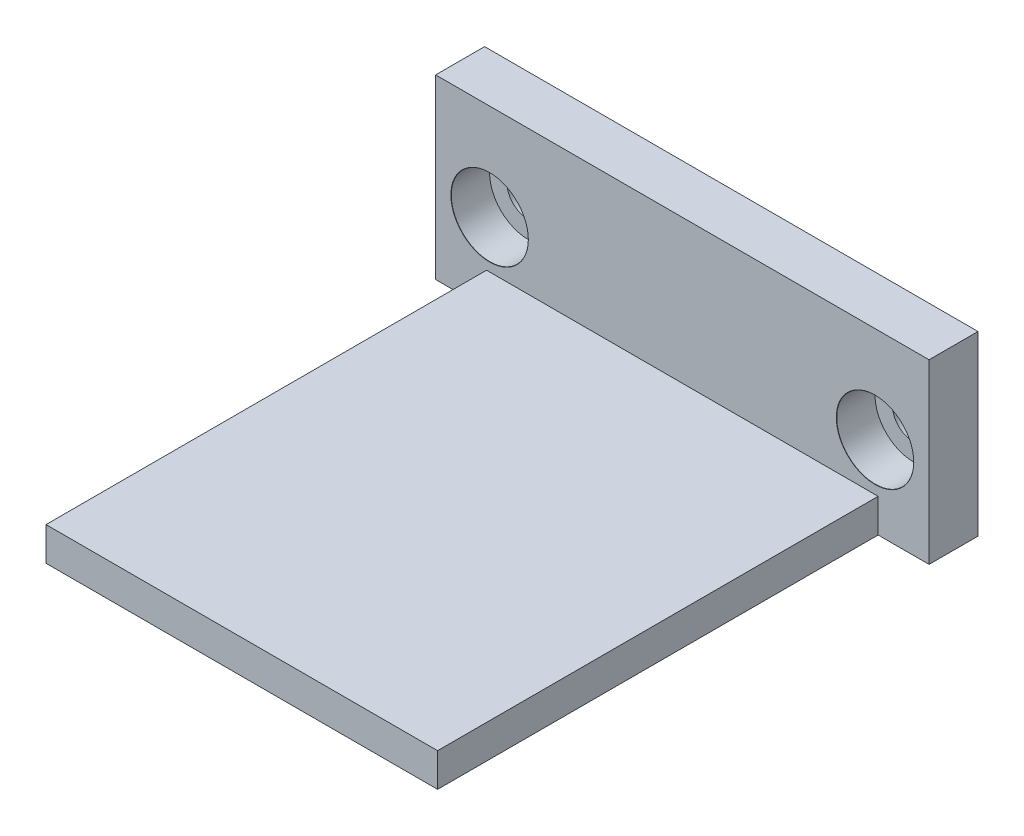
ISO-10303-21;
HEADER;
FILE_DESCRIPTION(('STEP AP214'),'2;1');
FILE_NAME('part.step','',(''),(''),'','','');
FILE_SCHEMA(('AUTOMOTIVE_DESIGN { 1 0 10303 214 1 1 1 1 }'));
ENDSEC;
DATA;
#1=APPLICATION_CONTEXT('core data for automotive mechanical design processes');
#2=APPLICATION_PROTOCOL_DEFINITION('international standard','automotive_design',2000,#1);
#3=PRODUCT_CONTEXT('',#1,'mechanical');
#4=PRODUCT('Part','Part','',(#3));
#5=PRODUCT_RELATED_PRODUCT_CATEGORY('part','',(#4));
#6=PRODUCT_DEFINITION_FORMATION('','',#4);
#7=PRODUCT_DEFINITION_CONTEXT('part definition',#1,'design');
#8=PRODUCT_DEFINITION('design','',#6,#7);
#9=PRODUCT_DEFINITION_SHAPE('','',#8);
#10=(LENGTH_UNIT() NAMED_UNIT(*) SI_UNIT(.MILLI.,.METRE.));
#11=(NAMED_UNIT(*) PLANE_ANGLE_UNIT() SI_UNIT($,.RADIAN.));
#12=(NAMED_UNIT(*) SI_UNIT($,.STERADIAN.) SOLID_ANGLE_UNIT());
#13=UNCERTAINTY_MEASURE_WITH_UNIT(LENGTH_MEASURE(1.E-05),#10,'distance_accuracy_value','');
#14=(GEOMETRIC_REPRESENTATION_CONTEXT(3) GLOBAL_UNCERTAINTY_ASSIGNED_CONTEXT((#13)) GLOBAL_UNIT_ASSIGNED_CONTEXT((#10,
#11,#12)) REPRESENTATION_CONTEXT('',''));
#15=CARTESIAN_POINT('',(0.,0.,0.));
#16=DIRECTION('',(0.,0.,1.));
#17=DIRECTION('',(1.,0.,0.));
#18=AXIS2_PLACEMENT_3D('',#15,#16,#17);
#19=CARTESIAN_POINT('',(0.,0.,6.35));
#20=DIRECTION('',(0.,0.,-1.));
#21=DIRECTION('',(-1.,0.,0.));
#22=AXIS2_PLACEMENT_3D('',#19,#20,#21);
#23=PLANE('',#22);
#24=DIRECTION('',(0.,-1.,0.));
#25=VECTOR('',#24,1.);
#26=CARTESIAN_POINT('',(0.,0.,6.35));
#27=LINE('',#26,#25);
#28=CARTESIAN_POINT('',(0.,24.9936,6.35));
#29=VERTEX_POINT('',#28);
#30=CARTESIAN_POINT('',(0.,2.000000064,6.35));
#31=VERTEX_POINT('',#30);
#32=EDGE_CURVE('E128',#29,#31,#27,.T.);
#33=ORIENTED_EDGE('',*,*,#32,.T.);
#34=DIRECTION('',(1.,0.,0.));
#35=VECTOR('',#34,1.);
#36=CARTESIAN_POINT('',(0.,2.000000064,6.35));
#37=LINE('',#36,#35);
#38=CARTESIAN_POINT('',(6.604,2.000000064,6.35));
#39=VERTEX_POINT('',#38);
#40=EDGE_CURVE('E199',#31,#39,#37,.T.);
#41=ORIENTED_EDGE('',*,*,#40,.T.);
#42=DIRECTION('',(0.,1.,0.));
#43=VECTOR('',#42,1.);
#44=CARTESIAN_POINT('',(6.604,6.35,6.35));
#45=LINE('',#44,#43);
#46=CARTESIAN_POINT('',(6.604,6.35,6.35));
#47=VERTEX_POINT('',#46);
#48=EDGE_CURVE('E193',#39,#47,#45,.T.);
#49=ORIENTED_EDGE('',*,*,#48,.T.);
#50=DIRECTION('',(-1.,0.,0.));
#51=VECTOR('',#50,1.);
#52=CARTESIAN_POINT('',(0.,6.35,6.35));
#53=LINE('',#52,#51);
#54=CARTESIAN_POINT('',(57.404,6.35,6.35));
#55=VERTEX_POINT('',#54);
#56=EDGE_CURVE('E147',#55,#47,#53,.T.);
#57=ORIENTED_EDGE('',*,*,#56,.F.);
#58=DIRECTION('',(0.,-1.,0.));
#59=VECTOR('',#58,1.);
#60=CARTESIAN_POINT('',(57.404,6.35,6.35));
#61=LINE('',#60,#59);
#62=CARTESIAN_POINT('',(57.404,2.000000064,6.35));
#63=VERTEX_POINT('',#62);
#64=EDGE_CURVE('E186',#55,#63,#61,.T.);
#65=ORIENTED_EDGE('',*,*,#64,.T.);
#66=CARTESIAN_POINT('',(64.008,2.000000064,6.35));
#67=VERTEX_POINT('',#66);
#68=EDGE_CURVE('E189',#63,#67,#37,.T.);
#69=ORIENTED_EDGE('',*,*,#68,.T.);
#70=DIRECTION('',(0.,1.,0.));
#71=VECTOR('',#70,1.);
#72=CARTESIAN_POINT('',(64.008,0.,6.35));
#73=LINE('',#72,#71);
#74=CARTESIAN_POINT('',(64.008,24.9936,6.35));
#75=VERTEX_POINT('',#74);
#76=EDGE_CURVE('E120',#67,#75,#73,.T.);
#77=ORIENTED_EDGE('',*,*,#76,.T.);
#78=DIRECTION('',(-1.,0.,0.));
#79=VECTOR('',#78,1.);
#80=CARTESIAN_POINT('',(0.,24.9936,6.35));
#81=LINE('',#80,#79);
#82=EDGE_CURVE('E136',#75,#29,#81,.T.);
#83=ORIENTED_EDGE('',*,*,#82,.T.);
#84=EDGE_LOOP('',(#33,#41,#49,#57,#65,#69,#77,#83));
#85=FACE_BOUND('',#84,.T.);
#86=CARTESIAN_POINT('',(57.,12.5,6.35));
#87=DIRECTION('',(0.,0.,1.));
#88=DIRECTION('',(1.,0.,0.));
#89=AXIS2_PLACEMENT_3D('',#86,#87,#88);
#90=CIRCLE('',#89,5.025);
#91=CARTESIAN_POINT('',(62.025,12.5,6.35));
#92=VERTEX_POINT('',#91);
#93=EDGE_CURVE('E164',#92,#92,#90,.T.);
#94=ORIENTED_EDGE('',*,*,#93,.F.);
#95=EDGE_LOOP('',(#94));
#96=FACE_BOUND('',#95,.T.);
#97=CARTESIAN_POINT('',(7.,12.5,6.35));
#98=DIRECTION('',(0.,0.,1.));
#99=DIRECTION('',(1.,0.,0.));
#100=AXIS2_PLACEMENT_3D('',#97,#98,#99);
#101=CIRCLE('',#100,5.025);
#102=CARTESIAN_POINT('',(12.025,12.5,6.35));
#103=VERTEX_POINT('',#102);
#104=EDGE_CURVE('E179',#103,#103,#101,.T.);
#105=ORIENTED_EDGE('',*,*,#104,.F.);
#106=EDGE_LOOP('',(#105));
#107=FACE_BOUND('',#106,.T.);
#108=ADVANCED_FACE('F39',(#85,#96,#107),#23,.F.);
#109=CARTESIAN_POINT('',(0.,0.,6.35));
#110=DIRECTION('',(1.,0.,0.));
#111=DIRECTION('',(0.,0.,-1.));
#112=AXIS2_PLACEMENT_3D('',#109,#110,#111);
#113=PLANE('',#112);
#114=DIRECTION('',(0.,-1.,0.));
#115=VECTOR('',#114,1.);
#116=CARTESIAN_POINT('',(0.,0.,0.));
#117=LINE('',#116,#115);
#118=CARTESIAN_POINT('',(0.,24.9936,0.));
#119=VERTEX_POINT('',#118);
#120=CARTESIAN_POINT('',(0.,2.000000064,0.));
#121=VERTEX_POINT('',#120);
#122=EDGE_CURVE('E126',#119,#121,#117,.T.);
#123=ORIENTED_EDGE('',*,*,#122,.T.);
#124=DIRECTION('',(0.,0.,1.));
#125=VECTOR('',#124,1.);
#126=CARTESIAN_POINT('',(0.,2.000000064,0.));
#127=LINE('',#126,#125);
#128=EDGE_CURVE('E108',#121,#31,#127,.T.);
#129=ORIENTED_EDGE('',*,*,#128,.T.);
#130=ORIENTED_EDGE('',*,*,#32,.F.);
#131=DIRECTION('',(0.,0.,-1.));
#132=VECTOR('',#131,1.);
#133=CARTESIAN_POINT('',(0.,24.9936,6.35));
#134=LINE('',#133,#132);
#135=EDGE_CURVE('E134',#29,#119,#134,.T.);
#136=ORIENTED_EDGE('',*,*,#135,.T.);
#137=EDGE_LOOP('',(#123,#129,#130,#136));
#138=FACE_BOUND('',#137,.T.);
#139=ADVANCED_FACE('F41',(#138),#113,.F.);
#140=CARTESIAN_POINT('',(64.008,0.,6.35));
#141=DIRECTION('',(-1.,0.,0.));
#142=DIRECTION('',(0.,0.,1.));
#143=AXIS2_PLACEMENT_3D('',#140,#141,#142);
#144=PLANE('',#143);
#145=ORIENTED_EDGE('',*,*,#76,.F.);
#146=DIRECTION('',(0.,0.,1.));
#147=VECTOR('',#146,1.);
#148=CARTESIAN_POINT('',(64.008,2.000000064,0.));
#149=LINE('',#148,#147);
#150=CARTESIAN_POINT('',(64.008,2.000000064,0.));
#151=VERTEX_POINT('',#150);
#152=EDGE_CURVE('E105',#151,#67,#149,.T.);
#153=ORIENTED_EDGE('',*,*,#152,.F.);
#154=DIRECTION('',(0.,1.,0.));
#155=VECTOR('',#154,1.);
#156=CARTESIAN_POINT('',(64.008,0.,0.));
#157=LINE('',#156,#155);
#158=CARTESIAN_POINT('',(64.008,24.9936,0.));
#159=VERTEX_POINT('',#158);
#160=EDGE_CURVE('E118',#151,#159,#157,.T.);
#161=ORIENTED_EDGE('',*,*,#160,.T.);
#162=DIRECTION('',(0.,0.,-1.));
#163=VECTOR('',#162,1.);
#164=CARTESIAN_POINT('',(64.008,24.9936,6.35));
#165=LINE('',#164,#163);
#166=EDGE_CURVE('E47',#75,#159,#165,.T.);
#167=ORIENTED_EDGE('',*,*,#166,.F.);
#168=EDGE_LOOP('',(#145,#153,#161,#167));
#169=FACE_BOUND('',#168,.T.);
#170=ADVANCED_FACE('F116',(#169),#144,.F.);
#171=CARTESIAN_POINT('',(0.,24.9936,6.35));
#172=DIRECTION('',(0.,-1.,0.));
#173=DIRECTION('',(0.,0.,-1.));
#174=AXIS2_PLACEMENT_3D('',#171,#172,#173);
#175=PLANE('',#174);
#176=DIRECTION('',(-1.,0.,0.));
#177=VECTOR('',#176,1.);
#178=CARTESIAN_POINT('',(0.,24.9936,0.));
#179=LINE('',#178,#177);
#180=EDGE_CURVE('E125',#159,#119,#179,.T.);
#181=ORIENTED_EDGE('',*,*,#180,.T.);
#182=ORIENTED_EDGE('',*,*,#135,.F.);
#183=ORIENTED_EDGE('',*,*,#82,.F.);
#184=ORIENTED_EDGE('',*,*,#166,.T.);
#185=EDGE_LOOP('',(#181,#182,#183,#184));
#186=FACE_BOUND('',#185,.T.);
#187=ADVANCED_FACE('F139',(#186),#175,.F.);
#188=CARTESIAN_POINT('',(0.,0.,0.));
#189=DIRECTION('',(0.,0.,-1.));
#190=DIRECTION('',(-1.,0.,0.));
#191=AXIS2_PLACEMENT_3D('',#188,#189,#190);
#192=PLANE('',#191);
#193=DIRECTION('',(-1.,0.,0.));
#194=VECTOR('',#193,1.);
#195=CARTESIAN_POINT('',(0.,2.000000064,0.));
#196=LINE('',#195,#194);
#197=EDGE_CURVE('E102',#151,#121,#196,.T.);
#198=ORIENTED_EDGE('',*,*,#197,.T.);
#199=ORIENTED_EDGE('',*,*,#122,.F.);
#200=ORIENTED_EDGE('',*,*,#180,.F.);
#201=ORIENTED_EDGE('',*,*,#160,.F.);
#202=EDGE_LOOP('',(#198,#199,#200,#201));
#203=FACE_BOUND('',#202,.T.);
#204=CARTESIAN_POINT('',(7.,12.5,0.));
#205=DIRECTION('',(0.,0.,-1.));
#206=DIRECTION('',(-1.,0.,0.));
#207=AXIS2_PLACEMENT_3D('',#204,#205,#206);
#208=CIRCLE('',#207,2.75);
#209=CARTESIAN_POINT('',(4.25,12.5,0.));
#210=VERTEX_POINT('',#209);
#211=EDGE_CURVE('E167',#210,#210,#208,.T.);
#212=ORIENTED_EDGE('',*,*,#211,.F.);
#213=EDGE_LOOP('',(#212));
#214=FACE_BOUND('',#213,.T.);
#215=CARTESIAN_POINT('',(57.,12.5,0.));
#216=DIRECTION('',(0.,0.,-1.));
#217=DIRECTION('',(-1.,0.,0.));
#218=AXIS2_PLACEMENT_3D('',#215,#216,#217);
#219=CIRCLE('',#218,2.75);
#220=CARTESIAN_POINT('',(54.25,12.5,0.));
#221=VERTEX_POINT('',#220);
#222=EDGE_CURVE('E150',#221,#221,#219,.T.);
#223=ORIENTED_EDGE('',*,*,#222,.F.);
#224=EDGE_LOOP('',(#223));
#225=FACE_BOUND('',#224,.T.);
#226=ADVANCED_FACE('F123',(#203,#214,#225),#192,.T.);
#227=CARTESIAN_POINT('',(0.,6.35,63.5));
#228=DIRECTION('',(0.,-1.,0.));
#229=DIRECTION('',(0.,0.,-1.));
#230=AXIS2_PLACEMENT_3D('',#227,#228,#229);
#231=PLANE('',#230);
#232=ORIENTED_EDGE('',*,*,#56,.T.);
#233=DIRECTION('',(0.,0.,1.));
#234=VECTOR('',#233,1.);
#235=CARTESIAN_POINT('',(6.604,6.35,-2.81162190881068));
#236=LINE('',#235,#234);
#237=CARTESIAN_POINT('',(6.604,6.35,63.5));
#238=VERTEX_POINT('',#237);
#239=EDGE_CURVE('E182',#47,#238,#236,.T.);
#240=ORIENTED_EDGE('',*,*,#239,.T.);
#241=DIRECTION('',(-1.,0.,0.));
#242=VECTOR('',#241,1.);
#243=CARTESIAN_POINT('',(0.,6.35,63.5));
#244=LINE('',#243,#242);
#245=CARTESIAN_POINT('',(57.404,6.35,63.5));
#246=VERTEX_POINT('',#245);
#247=EDGE_CURVE('E130',#246,#238,#244,.T.);
#248=ORIENTED_EDGE('',*,*,#247,.F.);
#249=DIRECTION('',(0.,0.,1.));
#250=VECTOR('',#249,1.);
#251=CARTESIAN_POINT('',(57.404,6.35,-2.81162190881068));
#252=LINE('',#251,#250);
#253=EDGE_CURVE('E61',#55,#246,#252,.T.);
#254=ORIENTED_EDGE('',*,*,#253,.F.);
#255=EDGE_LOOP('',(#232,#240,#248,#254));
#256=FACE_BOUND('',#255,.T.);
#257=ADVANCED_FACE('F213',(#256),#231,.F.);
#258=CARTESIAN_POINT('',(0.,0.,63.5));
#259=DIRECTION('',(0.,0.,-1.));
#260=DIRECTION('',(-1.,0.,0.));
#261=AXIS2_PLACEMENT_3D('',#258,#259,#260);
#262=PLANE('',#261);
#263=DIRECTION('',(0.,1.,0.));
#264=VECTOR('',#263,1.);
#265=CARTESIAN_POINT('',(6.604,6.35,63.5));
#266=LINE('',#265,#264);
#267=CARTESIAN_POINT('',(6.604,2.000000064,63.5));
#268=VERTEX_POINT('',#267);
#269=EDGE_CURVE('E185',#268,#238,#266,.T.);
#270=ORIENTED_EDGE('',*,*,#269,.F.);
#271=DIRECTION('',(-1.,0.,0.));
#272=VECTOR('',#271,1.);
#273=CARTESIAN_POINT('',(0.,2.000000064,63.5));
#274=LINE('',#273,#272);
#275=CARTESIAN_POINT('',(57.404,2.000000064,63.5));
#276=VERTEX_POINT('',#275);
#277=EDGE_CURVE('E54',#276,#268,#274,.T.);
#278=ORIENTED_EDGE('',*,*,#277,.F.);
#279=DIRECTION('',(0.,-1.,0.));
#280=VECTOR('',#279,1.);
#281=CARTESIAN_POINT('',(57.404,6.35,63.5));
#282=LINE('',#281,#280);
#283=EDGE_CURVE('E183',#246,#276,#282,.T.);
#284=ORIENTED_EDGE('',*,*,#283,.F.);
#285=ORIENTED_EDGE('',*,*,#247,.T.);
#286=EDGE_LOOP('',(#270,#278,#284,#285));
#287=FACE_BOUND('',#286,.T.);
#288=ADVANCED_FACE('F216',(#287),#262,.F.);
#289=CARTESIAN_POINT('',(57.,12.5,6.35));
#290=DIRECTION('',(0.,0.,1.));
#291=DIRECTION('',(1.,0.,0.));
#292=AXIS2_PLACEMENT_3D('',#289,#290,#291);
#293=CYLINDRICAL_SURFACE('',#292,2.75);
#294=CARTESIAN_POINT('',(57.,12.5,1.35));
#295=DIRECTION('',(0.,0.,1.));
#296=DIRECTION('',(1.,0.,0.));
#297=AXIS2_PLACEMENT_3D('',#294,#295,#296);
#298=CIRCLE('',#297,2.75);
#299=CARTESIAN_POINT('',(59.75,12.5,1.35));
#300=VERTEX_POINT('',#299);
#301=EDGE_CURVE('E155',#300,#300,#298,.T.);
#302=ORIENTED_EDGE('',*,*,#301,.T.);
#303=EDGE_LOOP('',(#302));
#304=FACE_BOUND('',#303,.T.);
#305=ORIENTED_EDGE('',*,*,#222,.T.);
#306=EDGE_LOOP('',(#305));
#307=FACE_BOUND('',#306,.T.);
#308=ADVANCED_FACE('F218',(#304,#307),#293,.F.);
#309=CARTESIAN_POINT('',(62.,12.5,1.35));
#310=DIRECTION('',(0.,0.,-1.));
#311=DIRECTION('',(-1.,0.,0.));
#312=AXIS2_PLACEMENT_3D('',#309,#310,#311);
#313=PLANE('',#312);
#314=ORIENTED_EDGE('',*,*,#301,.F.);
#315=EDGE_LOOP('',(#314));
#316=FACE_BOUND('',#315,.T.);
#317=CARTESIAN_POINT('',(57.,12.5,1.35));
#318=DIRECTION('',(0.,0.,1.));
#319=DIRECTION('',(1.,0.,0.));
#320=AXIS2_PLACEMENT_3D('',#317,#318,#319);
#321=CIRCLE('',#320,5.);
#322=CARTESIAN_POINT('',(62.,12.5,1.35));
#323=VERTEX_POINT('',#322);
#324=EDGE_CURVE('E158',#323,#323,#321,.T.);
#325=ORIENTED_EDGE('',*,*,#324,.T.);
#326=EDGE_LOOP('',(#325));
#327=FACE_BOUND('',#326,.T.);
#328=ADVANCED_FACE('F224',(#316,#327),#313,.F.);
#329=CARTESIAN_POINT('',(57.,12.5,6.35));
#330=DIRECTION('',(0.,0.,1.));
#331=DIRECTION('',(1.,0.,0.));
#332=AXIS2_PLACEMENT_3D('',#329,#330,#331);
#333=CYLINDRICAL_SURFACE('',#332,5.);
#334=ORIENTED_EDGE('',*,*,#324,.F.);
#335=EDGE_LOOP('',(#334));
#336=FACE_BOUND('',#335,.T.);
#337=CARTESIAN_POINT('',(57.,12.5,6.325));
#338=DIRECTION('',(0.,0.,1.));
#339=DIRECTION('',(1.,0.,0.));
#340=AXIS2_PLACEMENT_3D('',#337,#338,#339);
#341=CIRCLE('',#340,5.);
#342=CARTESIAN_POINT('',(62.,12.5,6.325));
#343=VERTEX_POINT('',#342);
#344=EDGE_CURVE('E161',#343,#343,#341,.T.);
#345=ORIENTED_EDGE('',*,*,#344,.T.);
#346=EDGE_LOOP('',(#345));
#347=FACE_BOUND('',#346,.T.);
#348=ADVANCED_FACE('F315',(#336,#347),#333,.F.);
#349=CARTESIAN_POINT('',(57.,12.5,6.35));
#350=DIRECTION('',(0.,0.,1.));
#351=DIRECTION('',(1.,0.,0.));
#352=AXIS2_PLACEMENT_3D('',#349,#350,#351);
#353=CONICAL_SURFACE('',#352,5.025,0.785398163397414);
#354=ORIENTED_EDGE('',*,*,#344,.F.);
#355=EDGE_LOOP('',(#354));
#356=FACE_BOUND('',#355,.T.);
#357=ORIENTED_EDGE('',*,*,#93,.T.);
#358=EDGE_LOOP('',(#357));
#359=FACE_BOUND('',#358,.T.);
#360=ADVANCED_FACE('F325',(#356,#359),#353,.F.);
#361=CARTESIAN_POINT('',(7.,12.5,6.35));
#362=DIRECTION('',(0.,0.,1.));
#363=DIRECTION('',(1.,0.,0.));
#364=AXIS2_PLACEMENT_3D('',#361,#362,#363);
#365=CYLINDRICAL_SURFACE('',#364,2.75);
#366=CARTESIAN_POINT('',(7.,12.5,1.35));
#367=DIRECTION('',(0.,0.,1.));
#368=DIRECTION('',(1.,0.,0.));
#369=AXIS2_PLACEMENT_3D('',#366,#367,#368);
#370=CIRCLE('',#369,2.75);
#371=CARTESIAN_POINT('',(9.75,12.5,1.35));
#372=VERTEX_POINT('',#371);
#373=EDGE_CURVE('E170',#372,#372,#370,.T.);
#374=ORIENTED_EDGE('',*,*,#373,.T.);
#375=EDGE_LOOP('',(#374));
#376=FACE_BOUND('',#375,.T.);
#377=ORIENTED_EDGE('',*,*,#211,.T.);
#378=EDGE_LOOP('',(#377));
#379=FACE_BOUND('',#378,.T.);
#380=ADVANCED_FACE('F335',(#376,#379),#365,.F.);
#381=CARTESIAN_POINT('',(12.,12.5,1.35));
#382=DIRECTION('',(0.,0.,-1.));
#383=DIRECTION('',(-1.,0.,0.));
#384=AXIS2_PLACEMENT_3D('',#381,#382,#383);
#385=PLANE('',#384);
#386=ORIENTED_EDGE('',*,*,#373,.F.);
#387=EDGE_LOOP('',(#386));
#388=FACE_BOUND('',#387,.T.);
#389=CARTESIAN_POINT('',(7.,12.5,1.35));
#390=DIRECTION('',(0.,0.,1.));
#391=DIRECTION('',(1.,0.,0.));
#392=AXIS2_PLACEMENT_3D('',#389,#390,#391);
#393=CIRCLE('',#392,5.);
#394=CARTESIAN_POINT('',(12.,12.5,1.35));
#395=VERTEX_POINT('',#394);
#396=EDGE_CURVE('E173',#395,#395,#393,.T.);
#397=ORIENTED_EDGE('',*,*,#396,.T.);
#398=EDGE_LOOP('',(#397));
#399=FACE_BOUND('',#398,.T.);
#400=ADVANCED_FACE('F345',(#388,#399),#385,.F.);
#401=CARTESIAN_POINT('',(7.,12.5,6.35));
#402=DIRECTION('',(0.,0.,1.));
#403=DIRECTION('',(1.,0.,0.));
#404=AXIS2_PLACEMENT_3D('',#401,#402,#403);
#405=CYLINDRICAL_SURFACE('',#404,5.);
#406=ORIENTED_EDGE('',*,*,#396,.F.);
#407=EDGE_LOOP('',(#406));
#408=FACE_BOUND('',#407,.T.);
#409=CARTESIAN_POINT('',(7.,12.5,6.325));
#410=DIRECTION('',(0.,0.,1.));
#411=DIRECTION('',(1.,0.,0.));
#412=AXIS2_PLACEMENT_3D('',#409,#410,#411);
#413=CIRCLE('',#412,5.);
#414=CARTESIAN_POINT('',(12.,12.5,6.325));
#415=VERTEX_POINT('',#414);
#416=EDGE_CURVE('E176',#415,#415,#413,.T.);
#417=ORIENTED_EDGE('',*,*,#416,.T.);
#418=EDGE_LOOP('',(#417));
#419=FACE_BOUND('',#418,.T.);
#420=ADVANCED_FACE('F355',(#408,#419),#405,.F.);
#421=CARTESIAN_POINT('',(7.,12.5,6.35));
#422=DIRECTION('',(0.,0.,1.));
#423=DIRECTION('',(1.,0.,0.));
#424=AXIS2_PLACEMENT_3D('',#421,#422,#423);
#425=CONICAL_SURFACE('',#424,5.025,0.785398163397414);
#426=ORIENTED_EDGE('',*,*,#416,.F.);
#427=EDGE_LOOP('',(#426));
#428=FACE_BOUND('',#427,.T.);
#429=ORIENTED_EDGE('',*,*,#104,.T.);
#430=EDGE_LOOP('',(#429));
#431=FACE_BOUND('',#430,.T.);
#432=ADVANCED_FACE('F262',(#428,#431),#425,.F.);
#433=CARTESIAN_POINT('',(57.404,6.35,-2.81162190881068));
#434=DIRECTION('',(-1.,0.,0.));
#435=DIRECTION('',(0.,0.,1.));
#436=AXIS2_PLACEMENT_3D('',#433,#434,#435);
#437=PLANE('',#436);
#438=ORIENTED_EDGE('',*,*,#283,.T.);
#439=DIRECTION('',(0.,0.,-1.));
#440=VECTOR('',#439,1.);
#441=CARTESIAN_POINT('',(57.404,2.000000064,-2.81162190881068));
#442=LINE('',#441,#440);
#443=EDGE_CURVE('E196',#276,#63,#442,.T.);
#444=ORIENTED_EDGE('',*,*,#443,.T.);
#445=ORIENTED_EDGE('',*,*,#64,.F.);
#446=ORIENTED_EDGE('',*,*,#253,.T.);
#447=EDGE_LOOP('',(#438,#444,#445,#446));
#448=FACE_BOUND('',#447,.T.);
#449=ADVANCED_FACE('F214',(#448),#437,.F.);
#450=CARTESIAN_POINT('',(6.604,6.35,-2.81162190881068));
#451=DIRECTION('',(1.,0.,0.));
#452=DIRECTION('',(0.,0.,-1.));
#453=AXIS2_PLACEMENT_3D('',#450,#451,#452);
#454=PLANE('',#453);
#455=ORIENTED_EDGE('',*,*,#48,.F.);
#456=DIRECTION('',(0.,0.,1.));
#457=VECTOR('',#456,1.);
#458=CARTESIAN_POINT('',(6.604,2.000000064,-2.81162190881068));
#459=LINE('',#458,#457);
#460=EDGE_CURVE('E11',#39,#268,#459,.T.);
#461=ORIENTED_EDGE('',*,*,#460,.T.);
#462=ORIENTED_EDGE('',*,*,#269,.T.);
#463=ORIENTED_EDGE('',*,*,#239,.F.);
#464=EDGE_LOOP('',(#455,#461,#462,#463));
#465=FACE_BOUND('',#464,.T.);
#466=ADVANCED_FACE('F209',(#465),#454,.F.);
#467=CARTESIAN_POINT('',(0.,2.000000064,0.));
#468=DIRECTION('',(0.,1.,0.));
#469=DIRECTION('',(0.,0.,1.));
#470=AXIS2_PLACEMENT_3D('',#467,#468,#469);
#471=PLANE('',#470);
#472=ORIENTED_EDGE('',*,*,#443,.F.);
#473=ORIENTED_EDGE('',*,*,#277,.T.);
#474=ORIENTED_EDGE('',*,*,#460,.F.);
#475=ORIENTED_EDGE('',*,*,#40,.F.);
#476=ORIENTED_EDGE('',*,*,#128,.F.);
#477=ORIENTED_EDGE('',*,*,#197,.F.);
#478=ORIENTED_EDGE('',*,*,#152,.T.);
#479=ORIENTED_EDGE('',*,*,#68,.F.);
#480=EDGE_LOOP('',(#472,#473,#474,#475,#476,#477,#478,#479));
#481=FACE_BOUND('',#480,.T.);
#482=ADVANCED_FACE('F104',(#481),#471,.F.);
#483=CLOSED_SHELL('',(#108,#139,#170,#187,#226,#257,#288,#308,#328,#348,#360,#380,#400,#420,
#432,#449,#466,#482));
#484=MANIFOLD_SOLID_BREP('B2',#483);
#485=ADVANCED_BREP_SHAPE_REPRESENTATION('',(#18,#484),#14);
#486=SHAPE_DEFINITION_REPRESENTATION(#9,#485);
ENDSEC;
END-ISO-10303-21;
